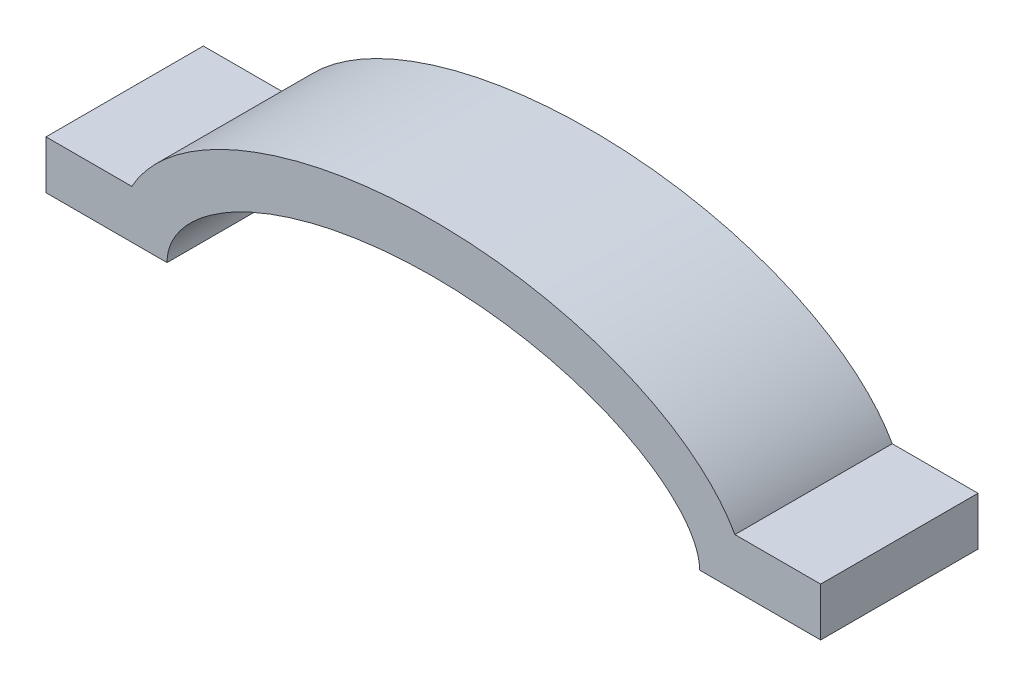
ISO-10303-21;
HEADER;
FILE_DESCRIPTION(('STEP AP214'),'2;1');
FILE_NAME('part.step','',(''),(''),'','','');
FILE_SCHEMA(('AUTOMOTIVE_DESIGN { 1 0 10303 214 1 1 1 1 }'));
ENDSEC;
DATA;
#1=APPLICATION_CONTEXT('core data for automotive mechanical design processes');
#2=APPLICATION_PROTOCOL_DEFINITION('international standard','automotive_design',2000,#1);
#3=PRODUCT_CONTEXT('',#1,'mechanical');
#4=PRODUCT('Part','Part','',(#3));
#5=PRODUCT_RELATED_PRODUCT_CATEGORY('part','',(#4));
#6=PRODUCT_DEFINITION_FORMATION('','',#4);
#7=PRODUCT_DEFINITION_CONTEXT('part definition',#1,'design');
#8=PRODUCT_DEFINITION('design','',#6,#7);
#9=PRODUCT_DEFINITION_SHAPE('','',#8);
#10=(LENGTH_UNIT() NAMED_UNIT(*) SI_UNIT(.MILLI.,.METRE.));
#11=(NAMED_UNIT(*) PLANE_ANGLE_UNIT() SI_UNIT($,.RADIAN.));
#12=(NAMED_UNIT(*) SI_UNIT($,.STERADIAN.) SOLID_ANGLE_UNIT());
#13=UNCERTAINTY_MEASURE_WITH_UNIT(LENGTH_MEASURE(1.E-05),#10,'distance_accuracy_value','');
#14=(GEOMETRIC_REPRESENTATION_CONTEXT(3) GLOBAL_UNCERTAINTY_ASSIGNED_CONTEXT((#13)) GLOBAL_UNIT_ASSIGNED_CONTEXT((#10,
#11,#12)) REPRESENTATION_CONTEXT('',''));
#15=CARTESIAN_POINT('',(0.,0.,0.));
#16=DIRECTION('',(0.,0.,1.));
#17=DIRECTION('',(1.,0.,0.));
#18=AXIS2_PLACEMENT_3D('',#15,#16,#17);
#19=CARTESIAN_POINT('',(-22.,0.,13.));
#20=CARTESIAN_POINT('',(-22.,0.432036641839711,13.));
#21=CARTESIAN_POINT('',(-21.8548863619666,1.29610992551914,13.));
#22=CARTESIAN_POINT('',(-20.9973878430744,2.88664464705841,13.));
#23=CARTESIAN_POINT('',(-19.2580049467167,4.66938679657808,13.));
#24=CARTESIAN_POINT('',(-15.7412521676776,6.99878575691308,13.));
#25=CARTESIAN_POINT('',(-9.3643610379705,9.3281522587363,13.));
#26=CARTESIAN_POINT('',(0.,10.3359238706319,13.));
#27=CARTESIAN_POINT('',(9.36436103797051,9.3281522587363,13.));
#28=CARTESIAN_POINT('',(15.7412521676776,6.99878575691308,13.));
#29=CARTESIAN_POINT('',(19.2580049467167,4.66938679657808,13.));
#30=CARTESIAN_POINT('',(20.9973878430744,2.8866446470584,13.));
#31=CARTESIAN_POINT('',(21.8548863619666,1.29610992551914,13.));
#32=CARTESIAN_POINT('',(22.,0.432036641839715,13.));
#33=CARTESIAN_POINT('',(22.,0.,13.));
#34=B_SPLINE_CURVE_WITH_KNOTS('',3,(#19,#20,#21,#22,#23,#24,#25,#26,#27,#28,#29,#30,#31,#32,
#33),.UNSPECIFIED.,.F.,.F.,(4,1,1,1,1,1,1,1,1,1,1,1,4),(3.14159265358979,3.33794219443916,
3.53429173528852,3.73064127613788,3.92699081698724,4.31968989868597,4.71238898038469,
5.10508806208341,5.49778714378214,5.6941366846315,5.89048622548086,6.08683576633022,
6.28318530717959),.UNSPECIFIED.);
#35=DIRECTION('',(0.,0.,-1.));
#36=VECTOR('',#35,1.);
#37=SURFACE_OF_LINEAR_EXTRUSION('',#34,#36);
#38=CARTESIAN_POINT('',(-22.,0.,0.));
#39=CARTESIAN_POINT('',(-22.,0.432036641839711,0.));
#40=CARTESIAN_POINT('',(-21.8548863619666,1.29610992551914,0.));
#41=CARTESIAN_POINT('',(-20.9973878430744,2.88664464705841,0.));
#42=CARTESIAN_POINT('',(-19.2580049467167,4.66938679657808,0.));
#43=CARTESIAN_POINT('',(-15.7412521676776,6.99878575691308,0.));
#44=CARTESIAN_POINT('',(-9.3643610379705,9.3281522587363,0.));
#45=CARTESIAN_POINT('',(0.,10.3359238706319,0.));
#46=CARTESIAN_POINT('',(9.36436103797051,9.3281522587363,0.));
#47=CARTESIAN_POINT('',(15.7412521676776,6.99878575691308,0.));
#48=CARTESIAN_POINT('',(19.2580049467167,4.66938679657808,0.));
#49=CARTESIAN_POINT('',(20.9973878430744,2.8866446470584,0.));
#50=CARTESIAN_POINT('',(21.8548863619666,1.29610992551914,0.));
#51=CARTESIAN_POINT('',(22.,0.432036641839715,0.));
#52=CARTESIAN_POINT('',(22.,0.,0.));
#53=B_SPLINE_CURVE_WITH_KNOTS('',3,(#38,#39,#40,#41,#42,#43,#44,#45,#46,#47,#48,#49,#50,#51,
#52),.UNSPECIFIED.,.F.,.F.,(4,1,1,1,1,1,1,1,1,1,1,1,4),(3.14159265358979,3.33794219443916,
3.53429173528852,3.73064127613788,3.92699081698724,4.31968989868597,4.71238898038469,
5.10508806208341,5.49778714378214,5.6941366846315,5.89048622548086,6.08683576633022,
6.28318530717959),.UNSPECIFIED.);
#54=CARTESIAN_POINT('',(-22.,0.,0.));
#55=VERTEX_POINT('',#54);
#56=CARTESIAN_POINT('',(22.,0.,0.));
#57=VERTEX_POINT('',#56);
#58=EDGE_CURVE('E132',#55,#57,#53,.T.);
#59=ORIENTED_EDGE('',*,*,#58,.T.);
#60=DIRECTION('',(0.,0.,-1.));
#61=VECTOR('',#60,1.);
#62=CARTESIAN_POINT('',(22.,0.,13.));
#63=LINE('',#62,#61);
#64=CARTESIAN_POINT('',(22.,0.,13.));
#65=VERTEX_POINT('',#64);
#66=EDGE_CURVE('E11',#65,#57,#63,.T.);
#67=ORIENTED_EDGE('',*,*,#66,.F.);
#68=CARTESIAN_POINT('',(-22.,0.,13.));
#69=VERTEX_POINT('',#68);
#70=EDGE_CURVE('E151',#69,#65,#34,.T.);
#71=ORIENTED_EDGE('',*,*,#70,.F.);
#72=DIRECTION('',(0.,0.,-1.));
#73=VECTOR('',#72,1.);
#74=CARTESIAN_POINT('',(-22.,0.,13.));
#75=LINE('',#74,#73);
#76=EDGE_CURVE('E128',#69,#55,#75,.T.);
#77=ORIENTED_EDGE('',*,*,#76,.T.);
#78=EDGE_LOOP('',(#59,#67,#71,#77));
#79=FACE_BOUND('',#78,.T.);
#80=ADVANCED_FACE('F35',(#79),#37,.F.);
#81=CARTESIAN_POINT('',(22.,0.,13.));
#82=DIRECTION('',(0.,1.,0.));
#83=DIRECTION('',(-1.,0.,0.));
#84=AXIS2_PLACEMENT_3D('',#81,#82,#83);
#85=PLANE('',#84);
#86=DIRECTION('',(1.,0.,0.));
#87=VECTOR('',#86,1.);
#88=CARTESIAN_POINT('',(22.,0.,0.));
#89=LINE('',#88,#87);
#90=CARTESIAN_POINT('',(32.,0.,0.));
#91=VERTEX_POINT('',#90);
#92=EDGE_CURVE('E137',#57,#91,#89,.T.);
#93=ORIENTED_EDGE('',*,*,#92,.T.);
#94=DIRECTION('',(0.,0.,-1.));
#95=VECTOR('',#94,1.);
#96=CARTESIAN_POINT('',(32.,0.,13.));
#97=LINE('',#96,#95);
#98=CARTESIAN_POINT('',(32.,0.,13.));
#99=VERTEX_POINT('',#98);
#100=EDGE_CURVE('E44',#99,#91,#97,.T.);
#101=ORIENTED_EDGE('',*,*,#100,.F.);
#102=DIRECTION('',(1.,0.,0.));
#103=VECTOR('',#102,1.);
#104=CARTESIAN_POINT('',(22.,0.,13.));
#105=LINE('',#104,#103);
#106=EDGE_CURVE('E95',#65,#99,#105,.T.);
#107=ORIENTED_EDGE('',*,*,#106,.F.);
#108=ORIENTED_EDGE('',*,*,#66,.T.);
#109=EDGE_LOOP('',(#93,#101,#107,#108));
#110=FACE_BOUND('',#109,.T.);
#111=ADVANCED_FACE('F190',(#110),#85,.F.);
#112=CARTESIAN_POINT('',(32.,0.,13.));
#113=DIRECTION('',(-1.,0.,0.));
#114=DIRECTION('',(0.,0.,1.));
#115=AXIS2_PLACEMENT_3D('',#112,#113,#114);
#116=PLANE('',#115);
#117=DIRECTION('',(0.,1.,0.));
#118=VECTOR('',#117,1.);
#119=CARTESIAN_POINT('',(32.,0.,0.));
#120=LINE('',#119,#118);
#121=CARTESIAN_POINT('',(32.,4.,0.));
#122=VERTEX_POINT('',#121);
#123=EDGE_CURVE('E142',#91,#122,#120,.T.);
#124=ORIENTED_EDGE('',*,*,#123,.T.);
#125=DIRECTION('',(0.,0.,-1.));
#126=VECTOR('',#125,1.);
#127=CARTESIAN_POINT('',(32.,4.,13.));
#128=LINE('',#127,#126);
#129=CARTESIAN_POINT('',(32.,4.,13.));
#130=VERTEX_POINT('',#129);
#131=EDGE_CURVE('E158',#130,#122,#128,.T.);
#132=ORIENTED_EDGE('',*,*,#131,.F.);
#133=DIRECTION('',(0.,1.,0.));
#134=VECTOR('',#133,1.);
#135=CARTESIAN_POINT('',(32.,0.,13.));
#136=LINE('',#135,#134);
#137=EDGE_CURVE('E166',#99,#130,#136,.T.);
#138=ORIENTED_EDGE('',*,*,#137,.F.);
#139=ORIENTED_EDGE('',*,*,#100,.T.);
#140=EDGE_LOOP('',(#124,#132,#138,#139));
#141=FACE_BOUND('',#140,.T.);
#142=ADVANCED_FACE('F164',(#141),#116,.F.);
#143=CARTESIAN_POINT('',(24.9161860349977,4.,13.));
#144=DIRECTION('',(0.,-1.,0.));
#145=DIRECTION('',(0.,0.,-1.));
#146=AXIS2_PLACEMENT_3D('',#143,#144,#145);
#147=PLANE('',#146);
#148=DIRECTION('',(-1.,0.,0.));
#149=VECTOR('',#148,1.);
#150=CARTESIAN_POINT('',(24.9161860349977,4.,0.));
#151=LINE('',#150,#149);
#152=CARTESIAN_POINT('',(24.9161860349977,3.99999999999999,0.));
#153=VERTEX_POINT('',#152);
#154=EDGE_CURVE('E144',#122,#153,#151,.T.);
#155=ORIENTED_EDGE('',*,*,#154,.T.);
#156=DIRECTION('',(0.,0.,-1.));
#157=VECTOR('',#156,1.);
#158=CARTESIAN_POINT('',(24.9161860349977,3.99999999999999,13.));
#159=LINE('',#158,#157);
#160=CARTESIAN_POINT('',(24.9161860349977,3.99999999999999,13.));
#161=VERTEX_POINT('',#160);
#162=EDGE_CURVE('E155',#161,#153,#159,.T.);
#163=ORIENTED_EDGE('',*,*,#162,.F.);
#164=DIRECTION('',(-1.,0.,0.));
#165=VECTOR('',#164,1.);
#166=CARTESIAN_POINT('',(24.9161860349977,4.,13.));
#167=LINE('',#166,#165);
#168=EDGE_CURVE('E178',#130,#161,#167,.T.);
#169=ORIENTED_EDGE('',*,*,#168,.F.);
#170=ORIENTED_EDGE('',*,*,#131,.T.);
#171=EDGE_LOOP('',(#155,#163,#169,#170));
#172=FACE_BOUND('',#171,.T.);
#173=ADVANCED_FACE('F174',(#172),#147,.F.);
#174=CARTESIAN_POINT('',(0.,0.,13.));
#175=DIRECTION('',(0.,0.,1.));
#176=DIRECTION('',(-1.,0.,0.));
#177=AXIS2_PLACEMENT_3D('',#174,#175,#176);
#178=ELLIPSE('',#177,26.,14.);
#179=DIRECTION('',(0.,0.,-1.));
#180=VECTOR('',#179,1.);
#181=SURFACE_OF_LINEAR_EXTRUSION('',#178,#180);
#182=CARTESIAN_POINT('',(0.,0.,0.));
#183=DIRECTION('',(0.,0.,1.));
#184=DIRECTION('',(-1.,0.,0.));
#185=AXIS2_PLACEMENT_3D('',#182,#183,#184);
#186=ELLIPSE('',#185,26.,14.);
#187=CARTESIAN_POINT('',(-24.9161860349977,4.,0.));
#188=VERTEX_POINT('',#187);
#189=EDGE_CURVE('E146',#153,#188,#186,.T.);
#190=ORIENTED_EDGE('',*,*,#189,.T.);
#191=DIRECTION('',(0.,0.,-1.));
#192=VECTOR('',#191,1.);
#193=CARTESIAN_POINT('',(-24.9161860349977,4.,13.));
#194=LINE('',#193,#192);
#195=CARTESIAN_POINT('',(-24.9161860349977,4.,13.));
#196=VERTEX_POINT('',#195);
#197=EDGE_CURVE('E123',#196,#188,#194,.T.);
#198=ORIENTED_EDGE('',*,*,#197,.F.);
#199=EDGE_CURVE('E114',#161,#196,#178,.T.);
#200=ORIENTED_EDGE('',*,*,#199,.F.);
#201=ORIENTED_EDGE('',*,*,#162,.T.);
#202=EDGE_LOOP('',(#190,#198,#200,#201));
#203=FACE_BOUND('',#202,.T.);
#204=ADVANCED_FACE('F177',(#203),#181,.F.);
#205=CARTESIAN_POINT('',(-24.9161860349977,4.,13.));
#206=DIRECTION('',(0.,-1.,0.));
#207=DIRECTION('',(1.,0.,0.));
#208=AXIS2_PLACEMENT_3D('',#205,#206,#207);
#209=PLANE('',#208);
#210=DIRECTION('',(-1.,0.,0.));
#211=VECTOR('',#210,1.);
#212=CARTESIAN_POINT('',(-24.9161860349977,4.,0.));
#213=LINE('',#212,#211);
#214=CARTESIAN_POINT('',(-32.,4.,0.));
#215=VERTEX_POINT('',#214);
#216=EDGE_CURVE('E122',#188,#215,#213,.T.);
#217=ORIENTED_EDGE('',*,*,#216,.T.);
#218=DIRECTION('',(0.,0.,-1.));
#219=VECTOR('',#218,1.);
#220=CARTESIAN_POINT('',(-32.,4.,13.));
#221=LINE('',#220,#219);
#222=CARTESIAN_POINT('',(-32.,4.,13.));
#223=VERTEX_POINT('',#222);
#224=EDGE_CURVE('E119',#223,#215,#221,.T.);
#225=ORIENTED_EDGE('',*,*,#224,.F.);
#226=DIRECTION('',(-1.,0.,0.));
#227=VECTOR('',#226,1.);
#228=CARTESIAN_POINT('',(-24.9161860349977,4.,13.));
#229=LINE('',#228,#227);
#230=EDGE_CURVE('E108',#196,#223,#229,.T.);
#231=ORIENTED_EDGE('',*,*,#230,.F.);
#232=ORIENTED_EDGE('',*,*,#197,.T.);
#233=EDGE_LOOP('',(#217,#225,#231,#232));
#234=FACE_BOUND('',#233,.T.);
#235=ADVANCED_FACE('F120',(#234),#209,.F.);
#236=CARTESIAN_POINT('',(-32.,0.,13.));
#237=DIRECTION('',(1.,0.,0.));
#238=DIRECTION('',(0.,0.,-1.));
#239=AXIS2_PLACEMENT_3D('',#236,#237,#238);
#240=PLANE('',#239);
#241=DIRECTION('',(0.,-1.,0.));
#242=VECTOR('',#241,1.);
#243=CARTESIAN_POINT('',(-32.,0.,0.));
#244=LINE('',#243,#242);
#245=CARTESIAN_POINT('',(-32.,0.,0.));
#246=VERTEX_POINT('',#245);
#247=EDGE_CURVE('E81',#215,#246,#244,.T.);
#248=ORIENTED_EDGE('',*,*,#247,.T.);
#249=DIRECTION('',(0.,0.,-1.));
#250=VECTOR('',#249,1.);
#251=CARTESIAN_POINT('',(-32.,0.,13.));
#252=LINE('',#251,#250);
#253=CARTESIAN_POINT('',(-32.,0.,13.));
#254=VERTEX_POINT('',#253);
#255=EDGE_CURVE('E124',#254,#246,#252,.T.);
#256=ORIENTED_EDGE('',*,*,#255,.F.);
#257=DIRECTION('',(0.,-1.,0.));
#258=VECTOR('',#257,1.);
#259=CARTESIAN_POINT('',(-32.,0.,13.));
#260=LINE('',#259,#258);
#261=EDGE_CURVE('E112',#223,#254,#260,.T.);
#262=ORIENTED_EDGE('',*,*,#261,.F.);
#263=ORIENTED_EDGE('',*,*,#224,.T.);
#264=EDGE_LOOP('',(#248,#256,#262,#263));
#265=FACE_BOUND('',#264,.T.);
#266=ADVANCED_FACE('F126',(#265),#240,.F.);
#267=CARTESIAN_POINT('',(-22.,0.,13.));
#268=DIRECTION('',(0.,1.,0.));
#269=DIRECTION('',(-1.,0.,0.));
#270=AXIS2_PLACEMENT_3D('',#267,#268,#269);
#271=PLANE('',#270);
#272=DIRECTION('',(1.,0.,0.));
#273=VECTOR('',#272,1.);
#274=CARTESIAN_POINT('',(-22.,0.,0.));
#275=LINE('',#274,#273);
#276=EDGE_CURVE('E87',#246,#55,#275,.T.);
#277=ORIENTED_EDGE('',*,*,#276,.T.);
#278=ORIENTED_EDGE('',*,*,#76,.F.);
#279=DIRECTION('',(1.,0.,0.));
#280=VECTOR('',#279,1.);
#281=CARTESIAN_POINT('',(-22.,0.,13.));
#282=LINE('',#281,#280);
#283=EDGE_CURVE('E52',#254,#69,#282,.T.);
#284=ORIENTED_EDGE('',*,*,#283,.F.);
#285=ORIENTED_EDGE('',*,*,#255,.T.);
#286=EDGE_LOOP('',(#277,#278,#284,#285));
#287=FACE_BOUND('',#286,.T.);
#288=ADVANCED_FACE('F198',(#287),#271,.F.);
#289=CARTESIAN_POINT('',(0.,10.,13.));
#290=DIRECTION('',(0.,0.,-1.));
#291=DIRECTION('',(-1.,0.,0.));
#292=AXIS2_PLACEMENT_3D('',#289,#290,#291);
#293=PLANE('',#292);
#294=ORIENTED_EDGE('',*,*,#70,.T.);
#295=ORIENTED_EDGE('',*,*,#106,.T.);
#296=ORIENTED_EDGE('',*,*,#137,.T.);
#297=ORIENTED_EDGE('',*,*,#168,.T.);
#298=ORIENTED_EDGE('',*,*,#199,.T.);
#299=ORIENTED_EDGE('',*,*,#230,.T.);
#300=ORIENTED_EDGE('',*,*,#261,.T.);
#301=ORIENTED_EDGE('',*,*,#283,.T.);
#302=EDGE_LOOP('',(#294,#295,#296,#297,#298,#299,#300,#301));
#303=FACE_BOUND('',#302,.T.);
#304=ADVANCED_FACE('F110',(#303),#293,.F.);
#305=CARTESIAN_POINT('',(0.,10.,0.));
#306=DIRECTION('',(0.,0.,-1.));
#307=DIRECTION('',(-1.,0.,0.));
#308=AXIS2_PLACEMENT_3D('',#305,#306,#307);
#309=PLANE('',#308);
#310=ORIENTED_EDGE('',*,*,#58,.F.);
#311=ORIENTED_EDGE('',*,*,#276,.F.);
#312=ORIENTED_EDGE('',*,*,#247,.F.);
#313=ORIENTED_EDGE('',*,*,#216,.F.);
#314=ORIENTED_EDGE('',*,*,#189,.F.);
#315=ORIENTED_EDGE('',*,*,#154,.F.);
#316=ORIENTED_EDGE('',*,*,#123,.F.);
#317=ORIENTED_EDGE('',*,*,#92,.F.);
#318=EDGE_LOOP('',(#310,#311,#312,#313,#314,#315,#316,#317));
#319=FACE_BOUND('',#318,.T.);
#320=ADVANCED_FACE('F170',(#319),#309,.T.);
#321=CLOSED_SHELL('',(#80,#111,#142,#173,#204,#235,#266,#288,#304,#320));
#322=MANIFOLD_SOLID_BREP('B2',#321);
#323=ADVANCED_BREP_SHAPE_REPRESENTATION('',(#18,#322),#14);
#324=SHAPE_DEFINITION_REPRESENTATION(#9,#323);
ENDSEC;
END-ISO-10303-21;
